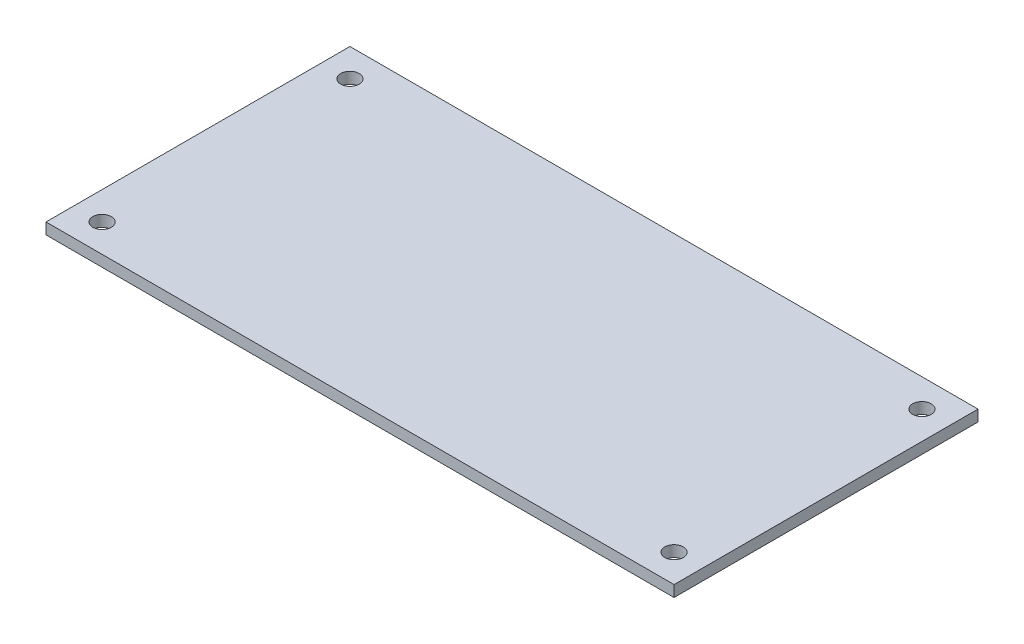
ISO-10303-21;
HEADER;
FILE_DESCRIPTION(('STEP AP214'),'2;1');
FILE_NAME('part.step','',(''),(''),'','','');
FILE_SCHEMA(('AUTOMOTIVE_DESIGN { 1 0 10303 214 1 1 1 1 }'));
ENDSEC;
DATA;
#1=APPLICATION_CONTEXT('core data for automotive mechanical design processes');
#2=APPLICATION_PROTOCOL_DEFINITION('international standard','automotive_design',2000,#1);
#3=PRODUCT_CONTEXT('',#1,'mechanical');
#4=PRODUCT('Part','Part','',(#3));
#5=PRODUCT_RELATED_PRODUCT_CATEGORY('part','',(#4));
#6=PRODUCT_DEFINITION_FORMATION('','',#4);
#7=PRODUCT_DEFINITION_CONTEXT('part definition',#1,'design');
#8=PRODUCT_DEFINITION('design','',#6,#7);
#9=PRODUCT_DEFINITION_SHAPE('','',#8);
#10=(LENGTH_UNIT() NAMED_UNIT(*) SI_UNIT(.MILLI.,.METRE.));
#11=(NAMED_UNIT(*) PLANE_ANGLE_UNIT() SI_UNIT($,.RADIAN.));
#12=(NAMED_UNIT(*) SI_UNIT($,.STERADIAN.) SOLID_ANGLE_UNIT());
#13=UNCERTAINTY_MEASURE_WITH_UNIT(LENGTH_MEASURE(1.E-05),#10,'distance_accuracy_value','');
#14=(GEOMETRIC_REPRESENTATION_CONTEXT(3) GLOBAL_UNCERTAINTY_ASSIGNED_CONTEXT((#13)) GLOBAL_UNIT_ASSIGNED_CONTEXT((#10,
#11,#12)) REPRESENTATION_CONTEXT('',''));
#15=CARTESIAN_POINT('',(0.,0.,0.));
#16=DIRECTION('',(0.,0.,1.));
#17=DIRECTION('',(1.,0.,0.));
#18=AXIS2_PLACEMENT_3D('',#15,#16,#17);
#19=CARTESIAN_POINT('',(0.,2.,0.));
#20=DIRECTION('',(0.,1.,0.));
#21=DIRECTION('',(0.,0.,1.));
#22=AXIS2_PLACEMENT_3D('',#19,#20,#21);
#23=PLANE('',#22);
#24=CARTESIAN_POINT('',(107.,2.,49.2));
#25=DIRECTION('',(0.,1.,0.));
#26=DIRECTION('',(0.,0.,1.));
#27=AXIS2_PLACEMENT_3D('',#24,#25,#26);
#28=CIRCLE('',#27,1.65);
#29=CARTESIAN_POINT('',(107.,2.,50.85));
#30=VERTEX_POINT('',#29);
#31=EDGE_CURVE('E127',#30,#30,#28,.T.);
#32=ORIENTED_EDGE('',*,*,#31,.F.);
#33=EDGE_LOOP('',(#32));
#34=FACE_BOUND('',#33,.T.);
#35=CARTESIAN_POINT('',(5.,2.,5.));
#36=DIRECTION('',(0.,1.,0.));
#37=DIRECTION('',(0.,0.,1.));
#38=AXIS2_PLACEMENT_3D('',#35,#36,#37);
#39=CIRCLE('',#38,1.65);
#40=CARTESIAN_POINT('',(5.,2.,6.65));
#41=VERTEX_POINT('',#40);
#42=EDGE_CURVE('E106',#41,#41,#39,.T.);
#43=ORIENTED_EDGE('',*,*,#42,.F.);
#44=EDGE_LOOP('',(#43));
#45=FACE_BOUND('',#44,.T.);
#46=DIRECTION('',(0.,0.,1.));
#47=VECTOR('',#46,1.);
#48=CARTESIAN_POINT('',(0.,2.,0.));
#49=LINE('',#48,#47);
#50=CARTESIAN_POINT('',(0.,2.,0.));
#51=VERTEX_POINT('',#50);
#52=CARTESIAN_POINT('',(0.,2.,54.2));
#53=VERTEX_POINT('',#52);
#54=EDGE_CURVE('E91',#51,#53,#49,.T.);
#55=ORIENTED_EDGE('',*,*,#54,.T.);
#56=DIRECTION('',(1.,0.,0.));
#57=VECTOR('',#56,1.);
#58=CARTESIAN_POINT('',(0.,2.,54.2));
#59=LINE('',#58,#57);
#60=CARTESIAN_POINT('',(112.,2.,54.2));
#61=VERTEX_POINT('',#60);
#62=EDGE_CURVE('E86',#53,#61,#59,.T.);
#63=ORIENTED_EDGE('',*,*,#62,.T.);
#64=DIRECTION('',(0.,0.,-1.));
#65=VECTOR('',#64,1.);
#66=CARTESIAN_POINT('',(112.,2.,0.));
#67=LINE('',#66,#65);
#68=CARTESIAN_POINT('',(112.,2.,0.));
#69=VERTEX_POINT('',#68);
#70=EDGE_CURVE('E89',#61,#69,#67,.T.);
#71=ORIENTED_EDGE('',*,*,#70,.T.);
#72=DIRECTION('',(-1.,0.,0.));
#73=VECTOR('',#72,1.);
#74=CARTESIAN_POINT('',(0.,2.,0.));
#75=LINE('',#74,#73);
#76=EDGE_CURVE('E56',#69,#51,#75,.T.);
#77=ORIENTED_EDGE('',*,*,#76,.T.);
#78=EDGE_LOOP('',(#55,#63,#71,#77));
#79=FACE_BOUND('',#78,.T.);
#80=CARTESIAN_POINT('',(107.,2.,5.));
#81=DIRECTION('',(0.,1.,0.));
#82=DIRECTION('',(0.,0.,1.));
#83=AXIS2_PLACEMENT_3D('',#80,#81,#82);
#84=CIRCLE('',#83,1.65);
#85=CARTESIAN_POINT('',(107.,2.,6.65));
#86=VERTEX_POINT('',#85);
#87=EDGE_CURVE('E121',#86,#86,#84,.T.);
#88=ORIENTED_EDGE('',*,*,#87,.F.);
#89=EDGE_LOOP('',(#88));
#90=FACE_BOUND('',#89,.T.);
#91=CARTESIAN_POINT('',(5.00000000000001,2.,49.2));
#92=DIRECTION('',(0.,1.,0.));
#93=DIRECTION('',(0.,0.,1.));
#94=AXIS2_PLACEMENT_3D('',#91,#92,#93);
#95=CIRCLE('',#94,1.65);
#96=CARTESIAN_POINT('',(5.00000000000001,2.,50.85));
#97=VERTEX_POINT('',#96);
#98=EDGE_CURVE('E133',#97,#97,#95,.T.);
#99=ORIENTED_EDGE('',*,*,#98,.F.);
#100=EDGE_LOOP('',(#99));
#101=FACE_BOUND('',#100,.T.);
#102=ADVANCED_FACE('F39',(#34,#45,#79,#90,#101),#23,.T.);
#103=CARTESIAN_POINT('',(0.,0.,0.));
#104=DIRECTION('',(0.,1.,0.));
#105=DIRECTION('',(0.,0.,1.));
#106=AXIS2_PLACEMENT_3D('',#103,#104,#105);
#107=PLANE('',#106);
#108=DIRECTION('',(0.,0.,1.));
#109=VECTOR('',#108,1.);
#110=CARTESIAN_POINT('',(0.,0.,0.));
#111=LINE('',#110,#109);
#112=CARTESIAN_POINT('',(0.,0.,0.));
#113=VERTEX_POINT('',#112);
#114=CARTESIAN_POINT('',(0.,0.,54.2));
#115=VERTEX_POINT('',#114);
#116=EDGE_CURVE('E103',#113,#115,#111,.T.);
#117=ORIENTED_EDGE('',*,*,#116,.F.);
#118=DIRECTION('',(-1.,0.,0.));
#119=VECTOR('',#118,1.);
#120=CARTESIAN_POINT('',(0.,0.,0.));
#121=LINE('',#120,#119);
#122=CARTESIAN_POINT('',(112.,0.,0.));
#123=VERTEX_POINT('',#122);
#124=EDGE_CURVE('E79',#123,#113,#121,.T.);
#125=ORIENTED_EDGE('',*,*,#124,.F.);
#126=DIRECTION('',(0.,0.,-1.));
#127=VECTOR('',#126,1.);
#128=CARTESIAN_POINT('',(112.,0.,0.));
#129=LINE('',#128,#127);
#130=CARTESIAN_POINT('',(112.,0.,54.2));
#131=VERTEX_POINT('',#130);
#132=EDGE_CURVE('E73',#131,#123,#129,.T.);
#133=ORIENTED_EDGE('',*,*,#132,.F.);
#134=DIRECTION('',(1.,0.,0.));
#135=VECTOR('',#134,1.);
#136=CARTESIAN_POINT('',(0.,0.,54.2));
#137=LINE('',#136,#135);
#138=EDGE_CURVE('E95',#115,#131,#137,.T.);
#139=ORIENTED_EDGE('',*,*,#138,.F.);
#140=EDGE_LOOP('',(#117,#125,#133,#139));
#141=FACE_BOUND('',#140,.T.);
#142=CARTESIAN_POINT('',(5.,0.,5.));
#143=DIRECTION('',(0.,1.,0.));
#144=DIRECTION('',(0.,0.,1.));
#145=AXIS2_PLACEMENT_3D('',#142,#143,#144);
#146=CIRCLE('',#145,1.65);
#147=CARTESIAN_POINT('',(5.,0.,6.65));
#148=VERTEX_POINT('',#147);
#149=EDGE_CURVE('E118',#148,#148,#146,.T.);
#150=ORIENTED_EDGE('',*,*,#149,.T.);
#151=EDGE_LOOP('',(#150));
#152=FACE_BOUND('',#151,.T.);
#153=CARTESIAN_POINT('',(107.,0.,5.));
#154=DIRECTION('',(0.,1.,0.));
#155=DIRECTION('',(0.,0.,1.));
#156=AXIS2_PLACEMENT_3D('',#153,#154,#155);
#157=CIRCLE('',#156,1.65);
#158=CARTESIAN_POINT('',(107.,0.,6.65));
#159=VERTEX_POINT('',#158);
#160=EDGE_CURVE('E124',#159,#159,#157,.T.);
#161=ORIENTED_EDGE('',*,*,#160,.T.);
#162=EDGE_LOOP('',(#161));
#163=FACE_BOUND('',#162,.T.);
#164=CARTESIAN_POINT('',(107.,0.,49.2));
#165=DIRECTION('',(0.,1.,0.));
#166=DIRECTION('',(0.,0.,1.));
#167=AXIS2_PLACEMENT_3D('',#164,#165,#166);
#168=CIRCLE('',#167,1.65);
#169=CARTESIAN_POINT('',(107.,0.,50.85));
#170=VERTEX_POINT('',#169);
#171=EDGE_CURVE('E130',#170,#170,#168,.T.);
#172=ORIENTED_EDGE('',*,*,#171,.T.);
#173=EDGE_LOOP('',(#172));
#174=FACE_BOUND('',#173,.T.);
#175=CARTESIAN_POINT('',(5.00000000000001,0.,49.2));
#176=DIRECTION('',(0.,1.,0.));
#177=DIRECTION('',(0.,0.,1.));
#178=AXIS2_PLACEMENT_3D('',#175,#176,#177);
#179=CIRCLE('',#178,1.65);
#180=CARTESIAN_POINT('',(5.00000000000001,0.,50.85));
#181=VERTEX_POINT('',#180);
#182=EDGE_CURVE('E136',#181,#181,#179,.T.);
#183=ORIENTED_EDGE('',*,*,#182,.T.);
#184=EDGE_LOOP('',(#183));
#185=FACE_BOUND('',#184,.T.);
#186=ADVANCED_FACE('F114',(#141,#152,#163,#174,#185),#107,.F.);
#187=CARTESIAN_POINT('',(0.,2.,0.));
#188=DIRECTION('',(1.,0.,0.));
#189=DIRECTION('',(0.,0.,-1.));
#190=AXIS2_PLACEMENT_3D('',#187,#188,#189);
#191=PLANE('',#190);
#192=ORIENTED_EDGE('',*,*,#116,.T.);
#193=DIRECTION('',(0.,-1.,0.));
#194=VECTOR('',#193,1.);
#195=CARTESIAN_POINT('',(0.,2.,54.2));
#196=LINE('',#195,#194);
#197=EDGE_CURVE('E11',#53,#115,#196,.T.);
#198=ORIENTED_EDGE('',*,*,#197,.F.);
#199=ORIENTED_EDGE('',*,*,#54,.F.);
#200=DIRECTION('',(0.,-1.,0.));
#201=VECTOR('',#200,1.);
#202=CARTESIAN_POINT('',(0.,2.,0.));
#203=LINE('',#202,#201);
#204=EDGE_CURVE('E99',#51,#113,#203,.T.);
#205=ORIENTED_EDGE('',*,*,#204,.T.);
#206=EDGE_LOOP('',(#192,#198,#199,#205));
#207=FACE_BOUND('',#206,.T.);
#208=ADVANCED_FACE('F41',(#207),#191,.F.);
#209=CARTESIAN_POINT('',(0.,2.,54.2));
#210=DIRECTION('',(0.,0.,-1.));
#211=DIRECTION('',(-1.,0.,0.));
#212=AXIS2_PLACEMENT_3D('',#209,#210,#211);
#213=PLANE('',#212);
#214=ORIENTED_EDGE('',*,*,#138,.T.);
#215=DIRECTION('',(0.,-1.,0.));
#216=VECTOR('',#215,1.);
#217=CARTESIAN_POINT('',(112.,2.,54.2));
#218=LINE('',#217,#216);
#219=EDGE_CURVE('E48',#61,#131,#218,.T.);
#220=ORIENTED_EDGE('',*,*,#219,.F.);
#221=ORIENTED_EDGE('',*,*,#62,.F.);
#222=ORIENTED_EDGE('',*,*,#197,.T.);
#223=EDGE_LOOP('',(#214,#220,#221,#222));
#224=FACE_BOUND('',#223,.T.);
#225=ADVANCED_FACE('F94',(#224),#213,.F.);
#226=CARTESIAN_POINT('',(112.,2.,0.));
#227=DIRECTION('',(-1.,0.,0.));
#228=DIRECTION('',(0.,0.,1.));
#229=AXIS2_PLACEMENT_3D('',#226,#227,#228);
#230=PLANE('',#229);
#231=ORIENTED_EDGE('',*,*,#132,.T.);
#232=DIRECTION('',(0.,-1.,0.));
#233=VECTOR('',#232,1.);
#234=CARTESIAN_POINT('',(112.,2.,0.));
#235=LINE('',#234,#233);
#236=EDGE_CURVE('E96',#69,#123,#235,.T.);
#237=ORIENTED_EDGE('',*,*,#236,.F.);
#238=ORIENTED_EDGE('',*,*,#70,.F.);
#239=ORIENTED_EDGE('',*,*,#219,.T.);
#240=EDGE_LOOP('',(#231,#237,#238,#239));
#241=FACE_BOUND('',#240,.T.);
#242=ADVANCED_FACE('F97',(#241),#230,.F.);
#243=CARTESIAN_POINT('',(0.,2.,0.));
#244=DIRECTION('',(0.,0.,1.));
#245=DIRECTION('',(1.,0.,0.));
#246=AXIS2_PLACEMENT_3D('',#243,#244,#245);
#247=PLANE('',#246);
#248=ORIENTED_EDGE('',*,*,#124,.T.);
#249=ORIENTED_EDGE('',*,*,#204,.F.);
#250=ORIENTED_EDGE('',*,*,#76,.F.);
#251=ORIENTED_EDGE('',*,*,#236,.T.);
#252=EDGE_LOOP('',(#248,#249,#250,#251));
#253=FACE_BOUND('',#252,.T.);
#254=ADVANCED_FACE('F111',(#253),#247,.F.);
#255=CARTESIAN_POINT('',(5.,2.,5.));
#256=DIRECTION('',(0.,-1.,0.));
#257=DIRECTION('',(0.,0.,-1.));
#258=AXIS2_PLACEMENT_3D('',#255,#256,#257);
#259=CYLINDRICAL_SURFACE('',#258,1.65);
#260=ORIENTED_EDGE('',*,*,#42,.T.);
#261=EDGE_LOOP('',(#260));
#262=FACE_BOUND('',#261,.T.);
#263=ORIENTED_EDGE('',*,*,#149,.F.);
#264=EDGE_LOOP('',(#263));
#265=FACE_BOUND('',#264,.T.);
#266=ADVANCED_FACE('F155',(#262,#265),#259,.F.);
#267=CARTESIAN_POINT('',(107.,2.,5.));
#268=DIRECTION('',(0.,-1.,0.));
#269=DIRECTION('',(0.,0.,-1.));
#270=AXIS2_PLACEMENT_3D('',#267,#268,#269);
#271=CYLINDRICAL_SURFACE('',#270,1.65);
#272=ORIENTED_EDGE('',*,*,#87,.T.);
#273=EDGE_LOOP('',(#272));
#274=FACE_BOUND('',#273,.T.);
#275=ORIENTED_EDGE('',*,*,#160,.F.);
#276=EDGE_LOOP('',(#275));
#277=FACE_BOUND('',#276,.T.);
#278=ADVANCED_FACE('F200',(#274,#277),#271,.F.);
#279=CARTESIAN_POINT('',(107.,2.,49.2));
#280=DIRECTION('',(0.,-1.,0.));
#281=DIRECTION('',(0.,0.,-1.));
#282=AXIS2_PLACEMENT_3D('',#279,#280,#281);
#283=CYLINDRICAL_SURFACE('',#282,1.65);
#284=ORIENTED_EDGE('',*,*,#31,.T.);
#285=EDGE_LOOP('',(#284));
#286=FACE_BOUND('',#285,.T.);
#287=ORIENTED_EDGE('',*,*,#171,.F.);
#288=EDGE_LOOP('',(#287));
#289=FACE_BOUND('',#288,.T.);
#290=ADVANCED_FACE('F208',(#286,#289),#283,.F.);
#291=CARTESIAN_POINT('',(5.00000000000001,2.,49.2));
#292=DIRECTION('',(0.,-1.,0.));
#293=DIRECTION('',(0.,0.,-1.));
#294=AXIS2_PLACEMENT_3D('',#291,#292,#293);
#295=CYLINDRICAL_SURFACE('',#294,1.65);
#296=ORIENTED_EDGE('',*,*,#98,.T.);
#297=EDGE_LOOP('',(#296));
#298=FACE_BOUND('',#297,.T.);
#299=ORIENTED_EDGE('',*,*,#182,.F.);
#300=EDGE_LOOP('',(#299));
#301=FACE_BOUND('',#300,.T.);
#302=ADVANCED_FACE('F142',(#298,#301),#295,.F.);
#303=CLOSED_SHELL('',(#102,#186,#208,#225,#242,#254,#266,#278,#290,#302));
#304=MANIFOLD_SOLID_BREP('B2',#303);
#305=ADVANCED_BREP_SHAPE_REPRESENTATION('',(#18,#304),#14);
#306=SHAPE_DEFINITION_REPRESENTATION(#9,#305);
ENDSEC;
END-ISO-10303-21;
